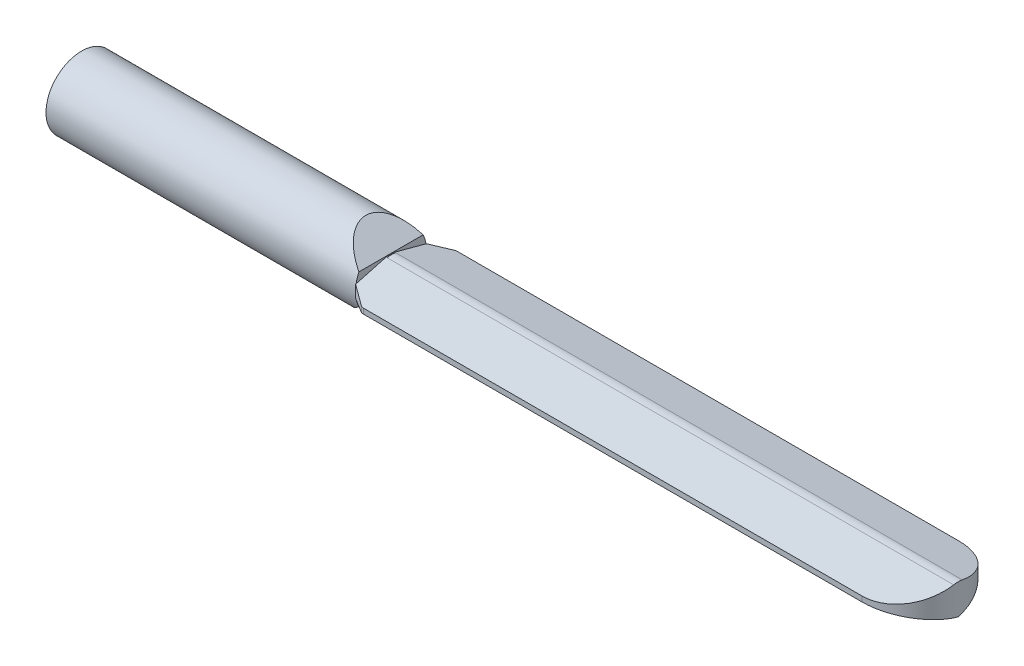
ISO-10303-21;
HEADER;
FILE_DESCRIPTION(('STEP AP214'),'2;1');
FILE_NAME('part.step','',(''),(''),'','','');
FILE_SCHEMA(('AUTOMOTIVE_DESIGN { 1 0 10303 214 1 1 1 1 }'));
ENDSEC;
DATA;
#1=APPLICATION_CONTEXT('core data for automotive mechanical design processes');
#2=APPLICATION_PROTOCOL_DEFINITION('international standard','automotive_design',2000,#1);
#3=PRODUCT_CONTEXT('',#1,'mechanical');
#4=PRODUCT('Part','Part','',(#3));
#5=PRODUCT_RELATED_PRODUCT_CATEGORY('part','',(#4));
#6=PRODUCT_DEFINITION_FORMATION('','',#4);
#7=PRODUCT_DEFINITION_CONTEXT('part definition',#1,'design');
#8=PRODUCT_DEFINITION('design','',#6,#7);
#9=PRODUCT_DEFINITION_SHAPE('','',#8);
#10=(LENGTH_UNIT() NAMED_UNIT(*) SI_UNIT(.MILLI.,.METRE.));
#11=(NAMED_UNIT(*) PLANE_ANGLE_UNIT() SI_UNIT($,.RADIAN.));
#12=(NAMED_UNIT(*) SI_UNIT($,.STERADIAN.) SOLID_ANGLE_UNIT());
#13=UNCERTAINTY_MEASURE_WITH_UNIT(LENGTH_MEASURE(1.E-05),#10,'distance_accuracy_value','');
#14=(GEOMETRIC_REPRESENTATION_CONTEXT(3) GLOBAL_UNCERTAINTY_ASSIGNED_CONTEXT((#13)) GLOBAL_UNIT_ASSIGNED_CONTEXT((#10,
#11,#12)) REPRESENTATION_CONTEXT('',''));
#15=CARTESIAN_POINT('',(0.,0.,0.));
#16=DIRECTION('',(0.,0.,1.));
#17=DIRECTION('',(1.,0.,0.));
#18=AXIS2_PLACEMENT_3D('',#15,#16,#17);
#19=CARTESIAN_POINT('',(-117.132239803963,2.8,8.56407466456359));
#20=DIRECTION('',(0.999999971842602,0.,0.000237307383945253));
#21=DIRECTION('',(0.000237307383945253,0.,-0.999999971842602));
#22=AXIS2_PLACEMENT_3D('',#19,#20,#21);
#23=CYLINDRICAL_SURFACE('',#22,6.42);
#24=CARTESIAN_POINT('',(-55.7280068959359,2.8,8.57864634284846));
#25=DIRECTION('',(0.627517438225577,-0.778602507524096,0.));
#26=DIRECTION('',(0.778602471360075,0.627517409079057,0.000304786302781807));
#27=AXIS2_PLACEMENT_3D('',#24,#25,#26);
#28=ELLIPSE('',#27,10.2307916715817,6.42);
#29=CARTESIAN_POINT('',(-59.1336186924822,0.0552351559265948,14.381515263114));
#30=VERTEX_POINT('',#29);
#31=CARTESIAN_POINT('',(-59.1308639326483,0.0574553643348558,2.77311222677423));
#32=VERTEX_POINT('',#31);
#33=EDGE_CURVE('E466',#30,#32,#28,.T.);
#34=ORIENTED_EDGE('',*,*,#33,.F.);
#35=CARTESIAN_POINT('',(-59.1322414370918,2.8,8.57783849283242));
#36=DIRECTION('',(-0.999999971842602,0.,-0.000237307383945253));
#37=DIRECTION('',(-0.000237307383945253,0.,0.999999971842602));
#38=AXIS2_PLACEMENT_3D('',#35,#36,#37);
#39=CIRCLE('',#38,6.42);
#40=CARTESIAN_POINT('',(-59.1337408927519,1.66359520688498,14.8964603281552));
#41=VERTEX_POINT('',#40);
#42=EDGE_CURVE('E447',#30,#41,#39,.T.);
#43=ORIENTED_EDGE('',*,*,#42,.T.);
#44=CARTESIAN_POINT('',(-59.1337602043918,2.29364272164236,14.9778384928324));
#45=VERTEX_POINT('',#44);
#46=EDGE_CURVE('E452',#41,#45,#39,.T.);
#47=ORIENTED_EDGE('',*,*,#46,.T.);
#48=CARTESIAN_POINT('',(-59.1337602043918,3.30635727835764,14.9778384928324));
#49=VERTEX_POINT('',#48);
#50=EDGE_CURVE('E443',#45,#49,#39,.T.);
#51=ORIENTED_EDGE('',*,*,#50,.T.);
#52=CARTESIAN_POINT('',(-59.1337408927519,3.93640479311502,14.8964603281552));
#53=VERTEX_POINT('',#52);
#54=EDGE_CURVE('E422',#49,#53,#39,.T.);
#55=ORIENTED_EDGE('',*,*,#54,.T.);
#56=CARTESIAN_POINT('',(-59.1336186924822,5.54476484407341,14.381515263114));
#57=VERTEX_POINT('',#56);
#58=EDGE_CURVE('E433',#53,#57,#39,.T.);
#59=ORIENTED_EDGE('',*,*,#58,.T.);
#60=CARTESIAN_POINT('',(-55.7280068959359,2.8,8.57864634284846));
#61=DIRECTION('',(0.627517438225577,0.778602507524095,0.));
#62=DIRECTION('',(0.778602471360075,-0.627517409079057,0.000304786302781807));
#63=AXIS2_PLACEMENT_3D('',#60,#61,#62);
#64=ELLIPSE('',#63,10.2307916715817,6.42);
#65=CARTESIAN_POINT('',(-59.1308639326483,5.54254463566515,2.77311222677423));
#66=VERTEX_POINT('',#65);
#67=EDGE_CURVE('E56',#66,#57,#64,.T.);
#68=ORIENTED_EDGE('',*,*,#67,.F.);
#69=CARTESIAN_POINT('',(-59.1307393914569,3.87395239703215,2.2483026494417));
#70=VERTEX_POINT('',#69);
#71=EDGE_CURVE('E437',#66,#70,#39,.T.);
#72=ORIENTED_EDGE('',*,*,#71,.T.);
#73=CARTESIAN_POINT('',(-59.1324678748693,3.87395228188942,2.24830221972318));
#74=CARTESIAN_POINT('',(-59.13214287009,3.87395230353957,2.24830230052267));
#75=CARTESIAN_POINT('',(-59.1318178653106,3.87395232518973,2.24830238132215));
#76=CARTESIAN_POINT('',(-59.1311678557519,3.87395236849005,2.24830254292113));
#77=CARTESIAN_POINT('',(-59.1308428509726,3.8739523901402,2.24830262372061));
#78=CARTESIAN_POINT('',(-59.1305178461932,3.87395241179036,2.2483027045201));
#79=B_SPLINE_CURVE_WITH_KNOTS('',3,(#73,#74,#75,#76,#77,#78),.UNSPECIFIED.,.F.,.F.,(4,2,4),(0.,
0.000975014370332675,0.00195002874066535),.UNSPECIFIED.);
#80=CARTESIAN_POINT('',(-59.1322414370918,3.87395229697354,2.24830227601791));
#81=VERTEX_POINT('',#80);
#82=EDGE_CURVE('E283',#81,#70,#79,.T.);
#83=ORIENTED_EDGE('',*,*,#82,.F.);
#84=CARTESIAN_POINT('',(-59.1322414370918,2.8,8.57783849283242));
#85=DIRECTION('',(-1.,0.,0.));
#86=DIRECTION('',(0.,0.,1.));
#87=AXIS2_PLACEMENT_3D('',#84,#85,#86);
#88=ELLIPSE('',#87,6.4200001807705,6.42);
#89=CARTESIAN_POINT('',(-59.1322414370918,3.24527621659354,2.17329858735413));
#90=VERTEX_POINT('',#89);
#91=EDGE_CURVE('E292',#90,#81,#88,.F.);
#92=ORIENTED_EDGE('',*,*,#91,.F.);
#93=CARTESIAN_POINT('',(-68.4825954280634,2.8,8.57561958472538));
#94=DIRECTION('',(0.564967003424933,0.,0.825113498278299));
#95=DIRECTION('',(0.825113498278299,0.,-0.564967003424933));
#96=AXIS2_PLACEMENT_3D('',#93,#94,#95);
#97=ELLIPSE('',#96,11.359558836909,6.42);
#98=CARTESIAN_POINT('',(-59.1307213454424,3.23003854493289,2.17225775887914));
#99=VERTEX_POINT('',#98);
#100=EDGE_CURVE('E514',#90,#99,#97,.F.);
#101=ORIENTED_EDGE('',*,*,#100,.T.);
#102=CARTESIAN_POINT('',(-59.1307213454424,2.36996145506712,2.17225775887914));
#103=VERTEX_POINT('',#102);
#104=EDGE_CURVE('E439',#99,#103,#39,.T.);
#105=ORIENTED_EDGE('',*,*,#104,.T.);
#106=CARTESIAN_POINT('',(-59.1322414370918,2.35472378340646,2.17329858735413));
#107=VERTEX_POINT('',#106);
#108=EDGE_CURVE('E293',#103,#107,#97,.F.);
#109=ORIENTED_EDGE('',*,*,#108,.T.);
#110=CARTESIAN_POINT('',(-59.1322414370918,1.72604770302646,2.24830227601791));
#111=VERTEX_POINT('',#110);
#112=EDGE_CURVE('E515',#111,#107,#88,.F.);
#113=ORIENTED_EDGE('',*,*,#112,.F.);
#114=CARTESIAN_POINT('',(-59.1305178461932,1.72604758820964,2.2483027045201));
#115=CARTESIAN_POINT('',(-59.1308428509726,1.7260476098598,2.24830262372061));
#116=CARTESIAN_POINT('',(-59.1311678557519,1.72604763150995,2.24830254292113));
#117=CARTESIAN_POINT('',(-59.1318178653106,1.72604767481027,2.24830238132215));
#118=CARTESIAN_POINT('',(-59.13214287009,1.72604769646043,2.24830230052267));
#119=CARTESIAN_POINT('',(-59.1324678748693,1.72604771811058,2.24830221972318));
#120=B_SPLINE_CURVE_WITH_KNOTS('',3,(#114,#115,#116,#117,#118,#119),.UNSPECIFIED.,.F.,.F.,(4,2,
4),(0.,0.000975014370332675,0.00195002874066535),.UNSPECIFIED.);
#121=CARTESIAN_POINT('',(-59.1307393914569,1.72604760296785,2.2483026494417));
#122=VERTEX_POINT('',#121);
#123=EDGE_CURVE('E303',#122,#111,#120,.T.);
#124=ORIENTED_EDGE('',*,*,#123,.F.);
#125=EDGE_CURVE('E450',#122,#32,#39,.T.);
#126=ORIENTED_EDGE('',*,*,#125,.T.);
#127=EDGE_LOOP('',(#34,#43,#47,#51,#55,#59,#68,#72,#83,#92,#101,#105,#109,#113,#124,#126));
#128=FACE_BOUND('',#127,.T.);
#129=CARTESIAN_POINT('',(-115.130716290558,2.8,8.56454964088584));
#130=DIRECTION('',(-1.,0.,0.));
#131=DIRECTION('',(0.,0.,1.));
#132=AXIS2_PLACEMENT_3D('',#129,#130,#131);
#133=ELLIPSE('',#132,6.4200001807705,6.42);
#134=CARTESIAN_POINT('',(-115.130716290558,2.8,14.9845498216563));
#135=VERTEX_POINT('',#134);
#136=EDGE_CURVE('E11',#135,#135,#133,.T.);
#137=ORIENTED_EDGE('',*,*,#136,.F.);
#138=EDGE_LOOP('',(#137));
#139=FACE_BOUND('',#138,.T.);
#140=ADVANCED_FACE('F40',(#128,#139),#23,.T.);
#141=CARTESIAN_POINT('',(34.8662397956082,0.,8.69000000000002));
#142=DIRECTION('',(0.,0.965925826289066,0.258819045102528));
#143=DIRECTION('',(1.,0.,0.));
#144=AXIS2_PLACEMENT_3D('',#141,#142,#143);
#145=PLANE('',#144);
#146=DIRECTION('',(1.,0.,0.));
#147=VECTOR('',#146,1.);
#148=CARTESIAN_POINT('',(34.8662397956082,0.000289587050011607,8.68891924641616));
#149=LINE('',#148,#147);
#150=CARTESIAN_POINT('',(-58.9436505515468,0.000289587050009449,8.68891924641616));
#151=VERTEX_POINT('',#150);
#152=CARTESIAN_POINT('',(43.5551590420244,0.000289587050012603,8.68891924641616));
#153=VERTEX_POINT('',#152);
#154=EDGE_CURVE('E343',#151,#153,#149,.T.);
#155=ORIENTED_EDGE('',*,*,#154,.F.);
#156=DIRECTION('',(0.,-0.258819045102528,0.965925826289066));
#157=VECTOR('',#156,1.);
#158=CARTESIAN_POINT('',(-58.9436505515468,0.,8.69000000000002));
#159=LINE('',#158,#157);
#160=CARTESIAN_POINT('',(-58.9436505515468,0.208340649413047,7.91246211110868));
#161=VERTEX_POINT('',#160);
#162=EDGE_CURVE('E458',#151,#161,#159,.F.);
#163=ORIENTED_EDGE('',*,*,#162,.T.);
#164=DIRECTION('',(0.305754930362129,0.246424264976754,-0.919667877111034));
#165=VECTOR('',#164,1.);
#166=CARTESIAN_POINT('',(-50.4080675965343,7.08762384967373,-17.7613723119185));
#167=LINE('',#166,#165);
#168=CARTESIAN_POINT('',(-59.1322181355043,0.0563639397648368,8.47964691308289));
#169=VERTEX_POINT('',#168);
#170=EDGE_CURVE('E461',#161,#169,#167,.F.);
#171=ORIENTED_EDGE('',*,*,#170,.T.);
#172=DIRECTION('',(0.00022922133135417,0.258819038303038,-0.965925800913027));
#173=VECTOR('',#172,1.);
#174=CARTESIAN_POINT('',(-59.1333280189343,-1.19683077944475,13.15663327695));
#175=LINE('',#174,#173);
#176=EDGE_CURVE('E324',#122,#169,#175,.F.);
#177=ORIENTED_EDGE('',*,*,#176,.F.);
#178=ORIENTED_EDGE('',*,*,#123,.T.);
#179=DIRECTION('',(0.,0.258819045102528,-0.965925826289066));
#180=VECTOR('',#179,1.);
#181=CARTESIAN_POINT('',(-59.1322414370918,0.403169246195493,7.18535188914924));
#182=LINE('',#181,#180);
#183=CARTESIAN_POINT('',(-59.1322414370918,1.74614488083327,2.17329858735413));
#184=VERTEX_POINT('',#183);
#185=EDGE_CURVE('E328',#184,#111,#182,.F.);
#186=ORIENTED_EDGE('',*,*,#185,.F.);
#187=DIRECTION('',(0.815818536320453,0.149677118278064,-0.558602610144214));
#188=VECTOR('',#187,1.);
#189=CARTESIAN_POINT('',(0.246375695347363,12.6402590790781,-38.4840891039518));
#190=LINE('',#189,#188);
#191=CARTESIAN_POINT('',(-55.958218902423,2.32847848222653,0.));
#192=VERTEX_POINT('',#191);
#193=EDGE_CURVE('E332',#192,#184,#190,.F.);
#194=ORIENTED_EDGE('',*,*,#193,.F.);
#195=DIRECTION('',(-1.,0.,0.));
#196=VECTOR('',#195,1.);
#197=CARTESIAN_POINT('',(-55.958218902423,2.32847848222653,0.));
#198=LINE('',#197,#196);
#199=CARTESIAN_POINT('',(34.8662397956082,2.32847848222653,0.));
#200=VERTEX_POINT('',#199);
#201=EDGE_CURVE('E336',#200,#192,#198,.T.);
#202=ORIENTED_EDGE('',*,*,#201,.F.);
#203=CARTESIAN_POINT('',(34.8662397956082,0.000289587049998562,8.68891924641621));
#204=DIRECTION('',(0.,0.965925826289066,0.258819045102528));
#205=DIRECTION('',(0.,-0.258819045102528,0.965925826289066));
#206=AXIS2_PLACEMENT_3D('',#203,#204,#205);
#207=ELLIPSE('',#206,8.99543112932145,8.68891924641621);
#208=EDGE_CURVE('E340',#153,#200,#207,.T.);
#209=ORIENTED_EDGE('',*,*,#208,.F.);
#210=EDGE_LOOP('',(#155,#163,#171,#177,#178,#186,#194,#202,#209));
#211=FACE_BOUND('',#210,.T.);
#212=ADVANCED_FACE('F276',(#211),#145,.F.);
#213=CARTESIAN_POINT('',(34.8662397956082,0.,8.6878384928323));
#214=DIRECTION('',(0.,0.965925826289069,-0.258819045102518));
#215=DIRECTION('',(-1.,0.,0.));
#216=AXIS2_PLACEMENT_3D('',#213,#214,#215);
#217=PLANE('',#216);
#218=DIRECTION('',(-0.305754930362118,-0.246424264976745,-0.91966787711104));
#219=VECTOR('',#218,1.);
#220=CARTESIAN_POINT('',(-50.4080675965349,7.08762384967324,35.1392108047501));
#221=LINE('',#220,#219);
#222=CARTESIAN_POINT('',(-59.1323173884015,0.0562839465420773,8.89789304097782));
#223=VERTEX_POINT('',#222);
#224=CARTESIAN_POINT('',(-58.9436505515468,0.208340649413051,9.46537638172371));
#225=VERTEX_POINT('',#224);
#226=EDGE_CURVE('E64',#223,#225,#221,.F.);
#227=ORIENTED_EDGE('',*,*,#226,.T.);
#228=DIRECTION('',(0.,0.258819045102518,0.965925826289069));
#229=VECTOR('',#228,1.);
#230=CARTESIAN_POINT('',(-58.9436505515468,0.,8.6878384928323));
#231=LINE('',#230,#229);
#232=EDGE_CURVE('E50',#225,#151,#231,.F.);
#233=ORIENTED_EDGE('',*,*,#232,.T.);
#234=ORIENTED_EDGE('',*,*,#154,.T.);
#235=CARTESIAN_POINT('',(34.8662397956082,0.000289587050024583,8.68891924641621));
#236=DIRECTION('',(0.,0.965925826289069,-0.258819045102518));
#237=DIRECTION('',(0.,-0.258819045102518,-0.965925826289069));
#238=AXIS2_PLACEMENT_3D('',#235,#236,#237);
#239=ELLIPSE('',#238,8.99543112932142,8.68891924641621);
#240=CARTESIAN_POINT('',(34.8662397956082,2.32847848222646,17.3778384928324));
#241=VERTEX_POINT('',#240);
#242=EDGE_CURVE('E361',#241,#153,#239,.T.);
#243=ORIENTED_EDGE('',*,*,#242,.F.);
#244=DIRECTION('',(1.,0.,0.));
#245=VECTOR('',#244,1.);
#246=CARTESIAN_POINT('',(34.8662397956082,2.32847848222646,17.3778384928324));
#247=LINE('',#246,#245);
#248=CARTESIAN_POINT('',(-55.3238356065649,2.32847848222646,17.3778384928324));
#249=VERTEX_POINT('',#248);
#250=EDGE_CURVE('E365',#249,#241,#247,.T.);
#251=ORIENTED_EDGE('',*,*,#250,.F.);
#252=CARTESIAN_POINT('',(-55.3238356065649,2.06052928979534,16.3778384928324));
#253=DIRECTION('',(0.,0.965925826289069,-0.258819045102518));
#254=DIRECTION('',(0.,-0.258819045102518,-0.965925826289069));
#255=AXIS2_PLACEMENT_3D('',#252,#253,#254);
#256=ELLIPSE('',#255,1.03527618041008,1.);
#257=CARTESIAN_POINT('',(-55.8893639621164,2.28151471962211,17.2025673446784));
#258=VERTEX_POINT('',#257);
#259=EDGE_CURVE('E317',#249,#258,#256,.F.);
#260=ORIENTED_EDGE('',*,*,#259,.T.);
#261=DIRECTION('',(-0.815420062977005,-0.149822501051534,-0.559145186041372));
#262=VECTOR('',#261,1.);
#263=CARTESIAN_POINT('',(-55.2340840696887,2.40191361195973,17.6519021280574));
#264=LINE('',#263,#262);
#265=CARTESIAN_POINT('',(-59.1337602043918,1.68540042039177,14.9778384928324));
#266=VERTEX_POINT('',#265);
#267=EDGE_CURVE('E368',#266,#258,#264,.F.);
#268=ORIENTED_EDGE('',*,*,#267,.F.);
#269=DIRECTION('',(0.00022922133135417,-0.258819038303028,-0.965925800913029));
#270=VECTOR('',#269,1.);
#271=CARTESIAN_POINT('',(-59.1339924452325,1.94762885562546,15.9564883363138));
#272=LINE('',#271,#270);
#273=EDGE_CURVE('E376',#41,#266,#272,.F.);
#274=ORIENTED_EDGE('',*,*,#273,.F.);
#275=EDGE_CURVE('E372',#223,#41,#272,.F.);
#276=ORIENTED_EDGE('',*,*,#275,.F.);
#277=EDGE_LOOP('',(#227,#233,#234,#243,#251,#260,#268,#274,#276));
#278=FACE_BOUND('',#277,.T.);
#279=ADVANCED_FACE('F272',(#278),#217,.F.);
#280=CARTESIAN_POINT('',(-59.1322414370918,2.8,8.57783849283242));
#281=DIRECTION('',(-0.999999971842602,0.,-0.000237307383945253));
#282=DIRECTION('',(-0.000237307383945253,0.,0.999999971842602));
#283=AXIS2_PLACEMENT_3D('',#280,#281,#282);
#284=PLANE('',#283);
#285=DIRECTION('',(0.000237307379604913,-0.000191258719927884,-0.999999953552654));
#286=VECTOR('',#285,1.);
#287=CARTESIAN_POINT('',(-59.1322413125653,5.54365473986928,8.57731374494412));
#288=LINE('',#287,#286);
#289=EDGE_CURVE('E435',#57,#66,#288,.T.);
#290=ORIENTED_EDGE('',*,*,#289,.F.);
#291=ORIENTED_EDGE('',*,*,#58,.F.);
#292=DIRECTION('',(-0.00022922133135417,-0.258819038303028,0.965925800913029));
#293=VECTOR('',#292,1.);
#294=CARTESIAN_POINT('',(-59.1343248031121,3.27709827494915,17.3570257517116));
#295=LINE('',#294,#293);
#296=CARTESIAN_POINT('',(-59.1324520563923,5.39165935058695,9.46537638172373));
#297=VERTEX_POINT('',#296);
#298=EDGE_CURVE('E426',#297,#53,#295,.T.);
#299=ORIENTED_EDGE('',*,*,#298,.F.);
#300=CARTESIAN_POINT('',(-59.1322677973756,2.49388187171974,8.68891924641618));
#301=DIRECTION('',(-0.999999971842602,0.,-0.000237307383945253));
#302=DIRECTION('',(-0.000237307383945253,0.,0.999999971842602));
#303=AXIS2_PLACEMENT_3D('',#300,#301,#302);
#304=ELLIPSE('',#303,3.0000000844722,3.);
#305=CARTESIAN_POINT('',(-59.1320835383589,5.39165935058694,7.9124621111086));
#306=VERTEX_POINT('',#305);
#307=EDGE_CURVE('E197',#297,#306,#304,.T.);
#308=ORIENTED_EDGE('',*,*,#307,.T.);
#309=DIRECTION('',(0.00022922133135417,-0.258819038303038,-0.965925800913027));
#310=VECTOR('',#309,1.);
#311=CARTESIAN_POINT('',(-59.1336602492637,7.17195962913816,14.5566332033906));
#312=LINE('',#311,#310);
#313=EDGE_CURVE('E228',#306,#70,#312,.T.);
#314=ORIENTED_EDGE('',*,*,#313,.T.);
#315=ORIENTED_EDGE('',*,*,#71,.F.);
#316=EDGE_LOOP('',(#290,#291,#299,#308,#314,#315));
#317=FACE_BOUND('',#316,.T.);
#318=ADVANCED_FACE('F275',(#317),#284,.F.);
#319=DIRECTION('',(-0.000237307379604913,-0.000191258719927884,0.999999953552654));
#320=VECTOR('',#319,1.);
#321=CARTESIAN_POINT('',(-59.1322413125653,0.0563452601307249,8.57731374494412));
#322=LINE('',#321,#320);
#323=EDGE_CURVE('E534',#32,#169,#322,.T.);
#324=ORIENTED_EDGE('',*,*,#323,.F.);
#325=ORIENTED_EDGE('',*,*,#125,.F.);
#326=ORIENTED_EDGE('',*,*,#176,.T.);
#327=EDGE_LOOP('',(#324,#325,#326));
#328=FACE_BOUND('',#327,.T.);
#329=ADVANCED_FACE('F533',(#328),#284,.F.);
#330=EDGE_CURVE('E213',#223,#30,#322,.T.);
#331=ORIENTED_EDGE('',*,*,#330,.F.);
#332=ORIENTED_EDGE('',*,*,#275,.T.);
#333=ORIENTED_EDGE('',*,*,#42,.F.);
#334=EDGE_LOOP('',(#331,#332,#333));
#335=FACE_BOUND('',#334,.T.);
#336=ADVANCED_FACE('F488',(#335),#284,.F.);
#337=CARTESIAN_POINT('',(34.8662397956082,2.49388187171974,8.68891924641617));
#338=DIRECTION('',(-1.,0.,0.));
#339=DIRECTION('',(0.,0.,1.));
#340=AXIS2_PLACEMENT_3D('',#337,#338,#339);
#341=CYLINDRICAL_SURFACE('',#340,3.);
#342=DIRECTION('',(-1.,0.,0.));
#343=VECTOR('',#342,1.);
#344=CARTESIAN_POINT('',(34.8662397956082,5.39165935058695,9.46537638172373));
#345=LINE('',#344,#343);
#346=CARTESIAN_POINT('',(-58.9436505515468,5.39165935058695,9.46537638172373));
#347=VERTEX_POINT('',#346);
#348=EDGE_CURVE('E210',#347,#297,#345,.T.);
#349=ORIENTED_EDGE('',*,*,#348,.F.);
#350=CARTESIAN_POINT('',(-55.3481858300042,2.49388187171974,8.68891924641618));
#351=DIRECTION('',(0.627517438225577,0.778602507524095,0.));
#352=DIRECTION('',(-0.778602507524095,0.627517438225577,0.));
#353=AXIS2_PLACEMENT_3D('',#350,#351,#352);
#354=ELLIPSE('',#353,4.78074363715383,3.);
#355=CARTESIAN_POINT('',(-58.9436505515468,5.39165935058695,7.91246211110863));
#356=VERTEX_POINT('',#355);
#357=EDGE_CURVE('E196',#347,#356,#354,.F.);
#358=ORIENTED_EDGE('',*,*,#357,.T.);
#359=DIRECTION('',(-1.,0.,0.));
#360=VECTOR('',#359,1.);
#361=CARTESIAN_POINT('',(-55.958218902423,5.39165935058694,7.9124621111086));
#362=LINE('',#361,#360);
#363=EDGE_CURVE('E209',#306,#356,#362,.F.);
#364=ORIENTED_EDGE('',*,*,#363,.F.);
#365=ORIENTED_EDGE('',*,*,#307,.F.);
#366=EDGE_LOOP('',(#349,#358,#364,#365));
#367=FACE_BOUND('',#366,.T.);
#368=ADVANCED_FACE('F42',(#367),#341,.T.);
#369=CARTESIAN_POINT('',(43.5203967151337,5.39165935058694,7.91246211110859));
#370=VERTEX_POINT('',#369);
#371=EDGE_CURVE('E216',#356,#370,#362,.F.);
#372=ORIENTED_EDGE('',*,*,#371,.F.);
#373=CARTESIAN_POINT('',(-58.9436505515468,2.49388187171974,8.68891924641618));
#374=DIRECTION('',(-1.,0.,0.));
#375=DIRECTION('',(0.,0.,1.));
#376=AXIS2_PLACEMENT_3D('',#373,#374,#375);
#377=CIRCLE('',#376,3.);
#378=EDGE_CURVE('E186',#356,#347,#377,.F.);
#379=ORIENTED_EDGE('',*,*,#378,.T.);
#380=CARTESIAN_POINT('',(43.5203967151337,5.39165935058695,9.46537638172373));
#381=VERTEX_POINT('',#380);
#382=EDGE_CURVE('E222',#381,#347,#345,.T.);
#383=ORIENTED_EDGE('',*,*,#382,.F.);
#384=CARTESIAN_POINT('',(43.5203967151337,5.39165935058694,7.91246211110859));
#385=CARTESIAN_POINT('',(43.5274161954196,5.41260344746621,7.99058563525631));
#386=CARTESIAN_POINT('',(43.5334336082892,5.4303914599033,8.06964927788868));
#387=CARTESIAN_POINT('',(43.5433491024557,5.45953968504035,8.22910629146036));
#388=CARTESIAN_POINT('',(43.5472465807495,5.47089806890734,8.30950003404535));
#389=CARTESIAN_POINT('',(43.5527396517106,5.48687543773905,8.46918347624755));
#390=CARTESIAN_POINT('',(43.5543856182854,5.49164193330061,8.54845665615965));
#391=CARTESIAN_POINT('',(43.5555023257781,5.49487587917558,8.70711320610669));
#392=CARTESIAN_POINT('',(43.5549738674154,5.49334564822244,8.78649652482056));
#393=CARTESIAN_POINT('',(43.5513109575309,5.48272745658037,8.96631680907991));
#394=CARTESIAN_POINT('',(43.5475093013821,5.47170433909288,9.06663130175489));
#395=CARTESIAN_POINT('',(43.5365074108368,5.4394509606525,9.26694570528913));
#396=CARTESIAN_POINT('',(43.5292577383407,5.41807213310539,9.36691901556857));
#397=CARTESIAN_POINT('',(43.5203967151337,5.39165935058695,9.46537638172373));
#398=B_SPLINE_CURVE_WITH_KNOTS('',3,(#384,#385,#386,#387,#388,#389,#390,#391,#392,#393,#394,
#395,#396,#397),.UNSPECIFIED.,.F.,.F.,(4,2,2,2,2,2,4),(0.,0.243492877537123,0.487054979031359,
0.725073383174689,0.963004146249747,1.26539270741895,1.5722540294871),.UNSPECIFIED.);
#399=EDGE_CURVE('E218',#370,#381,#398,.T.);
#400=ORIENTED_EDGE('',*,*,#399,.F.);
#401=EDGE_LOOP('',(#372,#379,#383,#400));
#402=FACE_BOUND('',#401,.T.);
#403=ADVANCED_FACE('F217',(#402),#341,.T.);
#404=CARTESIAN_POINT('',(-59.1337602043918,5.6,14.9778384928324));
#405=DIRECTION('',(-0.999999971842602,0.,-0.000237307383945253));
#406=DIRECTION('',(-0.000237307383945253,0.,0.999999971842602));
#407=AXIS2_PLACEMENT_3D('',#404,#405,#406);
#408=PLANE('',#407);
#409=DIRECTION('',(0.,-1.,0.));
#410=VECTOR('',#409,1.);
#411=CARTESIAN_POINT('',(-59.1337602043918,5.6,14.9778384928324));
#412=LINE('',#411,#410);
#413=EDGE_CURVE('E406',#45,#266,#412,.T.);
#414=ORIENTED_EDGE('',*,*,#413,.F.);
#415=ORIENTED_EDGE('',*,*,#46,.F.);
#416=ORIENTED_EDGE('',*,*,#273,.T.);
#417=EDGE_LOOP('',(#414,#415,#416));
#418=FACE_BOUND('',#417,.T.);
#419=ADVANCED_FACE('F257',(#418),#408,.T.);
#420=CARTESIAN_POINT('',(-55.958218902423,5.6,0.));
#421=DIRECTION('',(0.564967003424933,0.,0.825113498278299));
#422=DIRECTION('',(0.825113498278299,0.,-0.564967003424933));
#423=AXIS2_PLACEMENT_3D('',#420,#421,#422);
#424=PLANE('',#423);
#425=ORIENTED_EDGE('',*,*,#108,.F.);
#426=DIRECTION('',(0.,-1.,0.));
#427=VECTOR('',#426,1.);
#428=CARTESIAN_POINT('',(-59.1307213454424,5.6,2.17225775887914));
#429=LINE('',#428,#427);
#430=EDGE_CURVE('E430',#99,#103,#429,.T.);
#431=ORIENTED_EDGE('',*,*,#430,.F.);
#432=ORIENTED_EDGE('',*,*,#100,.F.);
#433=DIRECTION('',(0.,-1.,0.));
#434=VECTOR('',#433,1.);
#435=CARTESIAN_POINT('',(-59.1322414370918,5.6,2.17329858735413));
#436=LINE('',#435,#434);
#437=CARTESIAN_POINT('',(-59.1322414370918,3.85385511916673,2.17329858735413));
#438=VERTEX_POINT('',#437);
#439=EDGE_CURVE('E391',#438,#90,#436,.T.);
#440=ORIENTED_EDGE('',*,*,#439,.F.);
#441=DIRECTION('',(0.815818536320453,-0.149677118278064,-0.558602610144214));
#442=VECTOR('',#441,1.);
#443=CARTESIAN_POINT('',(-55.958218902423,3.27152151777347,0.));
#444=LINE('',#443,#442);
#445=CARTESIAN_POINT('',(-55.958218902423,3.27152151777347,0.));
#446=VERTEX_POINT('',#445);
#447=EDGE_CURVE('E346',#438,#446,#444,.T.);
#448=ORIENTED_EDGE('',*,*,#447,.T.);
#449=DIRECTION('',(0.,-1.,0.));
#450=VECTOR('',#449,1.);
#451=CARTESIAN_POINT('',(-55.958218902423,5.6,0.));
#452=LINE('',#451,#450);
#453=EDGE_CURVE('E395',#446,#192,#452,.T.);
#454=ORIENTED_EDGE('',*,*,#453,.T.);
#455=ORIENTED_EDGE('',*,*,#193,.T.);
#456=EDGE_CURVE('E396',#107,#184,#436,.T.);
#457=ORIENTED_EDGE('',*,*,#456,.F.);
#458=EDGE_LOOP('',(#425,#431,#432,#440,#448,#454,#455,#457));
#459=FACE_BOUND('',#458,.T.);
#460=ADVANCED_FACE('F253',(#459),#424,.F.);
#461=CARTESIAN_POINT('',(-59.1322414370918,5.6,8.57783849283242));
#462=DIRECTION('',(-1.,0.,0.));
#463=DIRECTION('',(0.,0.,1.));
#464=AXIS2_PLACEMENT_3D('',#461,#462,#463);
#465=PLANE('',#464);
#466=ORIENTED_EDGE('',*,*,#185,.T.);
#467=ORIENTED_EDGE('',*,*,#112,.T.);
#468=ORIENTED_EDGE('',*,*,#456,.T.);
#469=EDGE_LOOP('',(#466,#467,#468));
#470=FACE_BOUND('',#469,.T.);
#471=ADVANCED_FACE('F256',(#470),#465,.T.);
#472=ORIENTED_EDGE('',*,*,#439,.T.);
#473=ORIENTED_EDGE('',*,*,#91,.T.);
#474=DIRECTION('',(0.,-0.258819045102528,-0.965925826289066));
#475=VECTOR('',#474,1.);
#476=CARTESIAN_POINT('',(-59.1322414370918,5.5719596232081,8.58535188914927));
#477=LINE('',#476,#475);
#478=EDGE_CURVE('E349',#81,#438,#477,.T.);
#479=ORIENTED_EDGE('',*,*,#478,.T.);
#480=EDGE_LOOP('',(#472,#473,#479));
#481=FACE_BOUND('',#480,.T.);
#482=ADVANCED_FACE('F261',(#481),#465,.T.);
#483=CARTESIAN_POINT('',(-55.958218902423,3.27152151777347,0.));
#484=DIRECTION('',(0.,0.965925826289066,-0.258819045102528));
#485=DIRECTION('',(-1.,0.,0.));
#486=AXIS2_PLACEMENT_3D('',#483,#484,#485);
#487=PLANE('',#486);
#488=ORIENTED_EDGE('',*,*,#313,.F.);
#489=ORIENTED_EDGE('',*,*,#363,.T.);
#490=ORIENTED_EDGE('',*,*,#371,.T.);
#491=CARTESIAN_POINT('',(34.8662397956082,5.59971041295,8.68891924641621));
#492=DIRECTION('',(0.,0.965925826289066,-0.258819045102528));
#493=DIRECTION('',(0.,-0.258819045102528,-0.965925826289066));
#494=AXIS2_PLACEMENT_3D('',#491,#492,#493);
#495=ELLIPSE('',#494,8.99543112932145,8.68891924641621);
#496=CARTESIAN_POINT('',(34.8662397956082,3.27152151777347,0.));
#497=VERTEX_POINT('',#496);
#498=EDGE_CURVE('E354',#497,#370,#495,.F.);
#499=ORIENTED_EDGE('',*,*,#498,.F.);
#500=DIRECTION('',(1.,0.,0.));
#501=VECTOR('',#500,1.);
#502=CARTESIAN_POINT('',(34.8662397956082,3.27152151777347,0.));
#503=LINE('',#502,#501);
#504=EDGE_CURVE('E357',#446,#497,#503,.T.);
#505=ORIENTED_EDGE('',*,*,#504,.F.);
#506=ORIENTED_EDGE('',*,*,#447,.F.);
#507=ORIENTED_EDGE('',*,*,#478,.F.);
#508=ORIENTED_EDGE('',*,*,#82,.T.);
#509=EDGE_LOOP('',(#488,#489,#490,#499,#505,#506,#507,#508));
#510=FACE_BOUND('',#509,.T.);
#511=ADVANCED_FACE('F225',(#510),#487,.T.);
#512=DIRECTION('',(0.00022922133135417,0.258819038303028,-0.965925800913029));
#513=VECTOR('',#512,1.);
#514=CARTESIAN_POINT('',(-59.1336602149031,4.02749999406793,14.5564884098732));
#515=LINE('',#514,#513);
#516=CARTESIAN_POINT('',(-59.1337602043918,3.91459957960823,14.9778384928324));
#517=VERTEX_POINT('',#516);
#518=EDGE_CURVE('E380',#517,#53,#515,.T.);
#519=ORIENTED_EDGE('',*,*,#518,.T.);
#520=ORIENTED_EDGE('',*,*,#54,.F.);
#521=EDGE_CURVE('E295',#517,#49,#412,.T.);
#522=ORIENTED_EDGE('',*,*,#521,.F.);
#523=EDGE_LOOP('',(#519,#520,#522));
#524=FACE_BOUND('',#523,.T.);
#525=ADVANCED_FACE('F263',(#524),#408,.T.);
#526=CARTESIAN_POINT('',(-55.6337602043918,5.6,17.3778384928324));
#527=DIRECTION('',(-0.565528355551526,0.,0.824728851845979));
#528=DIRECTION('',(0.824728851845979,0.,0.565528355551526));
#529=AXIS2_PLACEMENT_3D('',#526,#527,#528);
#530=PLANE('',#529);
#531=ORIENTED_EDGE('',*,*,#267,.T.);
#532=DIRECTION('',(0.,-1.,0.));
#533=VECTOR('',#532,1.);
#534=CARTESIAN_POINT('',(-55.8893639621164,5.6,17.2025673446784));
#535=LINE('',#534,#533);
#536=CARTESIAN_POINT('',(-55.8893639621164,3.31848528037789,17.2025673446784));
#537=VERTEX_POINT('',#536);
#538=EDGE_CURVE('E314',#258,#537,#535,.F.);
#539=ORIENTED_EDGE('',*,*,#538,.T.);
#540=DIRECTION('',(-0.815420062977005,0.149822501051534,-0.559145186041372));
#541=VECTOR('',#540,1.);
#542=CARTESIAN_POINT('',(-55.9182263998485,3.32378836623976,17.182775958805));
#543=LINE('',#542,#541);
#544=EDGE_CURVE('E384',#537,#517,#543,.T.);
#545=ORIENTED_EDGE('',*,*,#544,.T.);
#546=ORIENTED_EDGE('',*,*,#521,.T.);
#547=DIRECTION('',(0.,-1.,0.));
#548=VECTOR('',#547,1.);
#549=CARTESIAN_POINT('',(-59.1337602043918,5.6,14.9778384928324));
#550=LINE('',#549,#548);
#551=EDGE_CURVE('E417',#49,#45,#550,.T.);
#552=ORIENTED_EDGE('',*,*,#551,.T.);
#553=ORIENTED_EDGE('',*,*,#413,.T.);
#554=EDGE_LOOP('',(#531,#539,#545,#546,#552,#553));
#555=FACE_BOUND('',#554,.T.);
#556=ADVANCED_FACE('F266',(#555),#530,.T.);
#557=CARTESIAN_POINT('',(34.8662397956082,5.6,17.3778384928324));
#558=DIRECTION('',(0.,0.,1.));
#559=DIRECTION('',(1.,0.,0.));
#560=AXIS2_PLACEMENT_3D('',#557,#558,#559);
#561=PLANE('',#560);
#562=DIRECTION('',(-1.,0.,0.));
#563=VECTOR('',#562,1.);
#564=CARTESIAN_POINT('',(-55.6337602043918,3.27152151777354,17.3778384928324));
#565=LINE('',#564,#563);
#566=CARTESIAN_POINT('',(34.8662397956082,3.27152151777354,17.3778384928324));
#567=VERTEX_POINT('',#566);
#568=CARTESIAN_POINT('',(-55.3238356065649,3.27152151777354,17.3778384928324));
#569=VERTEX_POINT('',#568);
#570=EDGE_CURVE('E387',#567,#569,#565,.T.);
#571=ORIENTED_EDGE('',*,*,#570,.T.);
#572=DIRECTION('',(0.,-1.,0.));
#573=VECTOR('',#572,1.);
#574=CARTESIAN_POINT('',(-55.3238356065649,5.6,17.3778384928324));
#575=LINE('',#574,#573);
#576=EDGE_CURVE('E320',#569,#249,#575,.T.);
#577=ORIENTED_EDGE('',*,*,#576,.T.);
#578=ORIENTED_EDGE('',*,*,#250,.T.);
#579=DIRECTION('',(0.,-1.,0.));
#580=VECTOR('',#579,1.);
#581=CARTESIAN_POINT('',(34.8662397956082,5.6,17.3778384928324));
#582=LINE('',#581,#580);
#583=EDGE_CURVE('E403',#567,#241,#582,.T.);
#584=ORIENTED_EDGE('',*,*,#583,.F.);
#585=EDGE_LOOP('',(#571,#577,#578,#584));
#586=FACE_BOUND('',#585,.T.);
#587=ADVANCED_FACE('F246',(#586),#561,.T.);
#588=CARTESIAN_POINT('',(34.8662397956082,5.6,8.68891924641621));
#589=DIRECTION('',(0.,-1.,0.));
#590=DIRECTION('',(0.,0.,-1.));
#591=AXIS2_PLACEMENT_3D('',#588,#589,#590);
#592=CYLINDRICAL_SURFACE('',#591,8.68891924641621);
#593=ORIENTED_EDGE('',*,*,#498,.T.);
#594=ORIENTED_EDGE('',*,*,#399,.T.);
#595=CARTESIAN_POINT('',(34.8662397956082,5.59971041294998,8.68891924641621));
#596=DIRECTION('',(0.,0.965925826289069,0.258819045102518));
#597=DIRECTION('',(0.,-0.258819045102518,0.965925826289069));
#598=AXIS2_PLACEMENT_3D('',#595,#596,#597);
#599=ELLIPSE('',#598,8.99543112932142,8.68891924641621);
#600=EDGE_CURVE('E377',#381,#567,#599,.F.);
#601=ORIENTED_EDGE('',*,*,#600,.T.);
#602=ORIENTED_EDGE('',*,*,#583,.T.);
#603=ORIENTED_EDGE('',*,*,#242,.T.);
#604=ORIENTED_EDGE('',*,*,#208,.T.);
#605=DIRECTION('',(0.,-1.,0.));
#606=VECTOR('',#605,1.);
#607=CARTESIAN_POINT('',(34.8662397956082,5.6,0.));
#608=LINE('',#607,#606);
#609=EDGE_CURVE('E400',#497,#200,#608,.T.);
#610=ORIENTED_EDGE('',*,*,#609,.F.);
#611=EDGE_LOOP('',(#593,#594,#601,#602,#603,#604,#610));
#612=FACE_BOUND('',#611,.T.);
#613=ADVANCED_FACE('F240',(#612),#592,.T.);
#614=CARTESIAN_POINT('',(-55.958218902423,5.6,0.));
#615=DIRECTION('',(0.,0.,-1.));
#616=DIRECTION('',(-1.,0.,0.));
#617=AXIS2_PLACEMENT_3D('',#614,#615,#616);
#618=PLANE('',#617);
#619=ORIENTED_EDGE('',*,*,#609,.T.);
#620=ORIENTED_EDGE('',*,*,#201,.T.);
#621=ORIENTED_EDGE('',*,*,#453,.F.);
#622=ORIENTED_EDGE('',*,*,#504,.T.);
#623=EDGE_LOOP('',(#619,#620,#621,#622));
#624=FACE_BOUND('',#623,.T.);
#625=ADVANCED_FACE('F245',(#624),#618,.T.);
#626=CARTESIAN_POINT('',(34.8662397956082,3.27152151777354,17.3778384928324));
#627=DIRECTION('',(0.,0.965925826289069,0.258819045102518));
#628=DIRECTION('',(1.,0.,0.));
#629=AXIS2_PLACEMENT_3D('',#626,#627,#628);
#630=PLANE('',#629);
#631=ORIENTED_EDGE('',*,*,#600,.F.);
#632=ORIENTED_EDGE('',*,*,#382,.T.);
#633=ORIENTED_EDGE('',*,*,#348,.T.);
#634=ORIENTED_EDGE('',*,*,#298,.T.);
#635=ORIENTED_EDGE('',*,*,#518,.F.);
#636=ORIENTED_EDGE('',*,*,#544,.F.);
#637=CARTESIAN_POINT('',(-55.3238356065649,3.53947071020466,16.3778384928324));
#638=DIRECTION('',(0.,0.965925826289069,0.258819045102518));
#639=DIRECTION('',(0.,-0.258819045102518,0.965925826289069));
#640=AXIS2_PLACEMENT_3D('',#637,#638,#639);
#641=ELLIPSE('',#640,1.03527618041008,1.);
#642=EDGE_CURVE('E311',#537,#569,#641,.T.);
#643=ORIENTED_EDGE('',*,*,#642,.T.);
#644=ORIENTED_EDGE('',*,*,#570,.F.);
#645=EDGE_LOOP('',(#631,#632,#633,#634,#635,#636,#643,#644));
#646=FACE_BOUND('',#645,.T.);
#647=ADVANCED_FACE('F251',(#646),#630,.T.);
#648=CARTESIAN_POINT('',(-55.3238356065649,5.6,16.3778384928324));
#649=DIRECTION('',(0.,-1.,0.));
#650=DIRECTION('',(0.,0.,-1.));
#651=AXIS2_PLACEMENT_3D('',#648,#649,#650);
#652=CYLINDRICAL_SURFACE('',#651,1.);
#653=ORIENTED_EDGE('',*,*,#642,.F.);
#654=ORIENTED_EDGE('',*,*,#538,.F.);
#655=ORIENTED_EDGE('',*,*,#259,.F.);
#656=ORIENTED_EDGE('',*,*,#576,.F.);
#657=EDGE_LOOP('',(#653,#654,#655,#656));
#658=FACE_BOUND('',#657,.T.);
#659=ADVANCED_FACE('F270',(#658),#652,.T.);
#660=ORIENTED_EDGE('',*,*,#104,.F.);
#661=ORIENTED_EDGE('',*,*,#430,.T.);
#662=EDGE_LOOP('',(#660,#661));
#663=FACE_BOUND('',#662,.T.);
#664=ADVANCED_FACE('F527',(#663),#284,.F.);
#665=ORIENTED_EDGE('',*,*,#551,.F.);
#666=ORIENTED_EDGE('',*,*,#50,.F.);
#667=EDGE_LOOP('',(#665,#666));
#668=FACE_BOUND('',#667,.T.);
#669=ADVANCED_FACE('F545',(#668),#284,.F.);
#670=CARTESIAN_POINT('',(-58.9436505515468,9.22,16.));
#671=DIRECTION('',(-1.,0.,0.));
#672=DIRECTION('',(0.,0.,1.));
#673=AXIS2_PLACEMENT_3D('',#670,#671,#672);
#674=PLANE('',#673);
#675=DIRECTION('',(0.,0.,-1.));
#676=VECTOR('',#675,1.);
#677=CARTESIAN_POINT('',(-58.9436505515468,5.39165935058695,16.));
#678=LINE('',#677,#676);
#679=EDGE_CURVE('E189',#347,#356,#678,.T.);
#680=ORIENTED_EDGE('',*,*,#679,.F.);
#681=ORIENTED_EDGE('',*,*,#378,.F.);
#682=EDGE_LOOP('',(#680,#681));
#683=FACE_BOUND('',#682,.T.);
#684=ADVANCED_FACE('F188',(#683),#674,.T.);
#685=CARTESIAN_POINT('',(-58.9436505515468,5.39165935058695,16.));
#686=DIRECTION('',(0.627517438225577,0.778602507524095,0.));
#687=DIRECTION('',(-0.778602507524095,0.627517438225577,0.));
#688=AXIS2_PLACEMENT_3D('',#685,#686,#687);
#689=PLANE('',#688);
#690=ORIENTED_EDGE('',*,*,#679,.T.);
#691=ORIENTED_EDGE('',*,*,#357,.F.);
#692=EDGE_LOOP('',(#690,#691));
#693=FACE_BOUND('',#692,.T.);
#694=ADVANCED_FACE('F201',(#693),#689,.T.);
#695=CARTESIAN_POINT('',(-58.9436505515468,-3.62,16.));
#696=DIRECTION('',(-1.,0.,0.));
#697=DIRECTION('',(0.,0.,1.));
#698=AXIS2_PLACEMENT_3D('',#695,#696,#697);
#699=PLANE('',#698);
#700=ORIENTED_EDGE('',*,*,#232,.F.);
#701=DIRECTION('',(0.,0.,-1.));
#702=VECTOR('',#701,1.);
#703=CARTESIAN_POINT('',(-58.9436505515468,0.208340649413053,16.));
#704=LINE('',#703,#702);
#705=EDGE_CURVE('E203',#225,#161,#704,.T.);
#706=ORIENTED_EDGE('',*,*,#705,.T.);
#707=ORIENTED_EDGE('',*,*,#162,.F.);
#708=EDGE_LOOP('',(#700,#706,#707));
#709=FACE_BOUND('',#708,.T.);
#710=ADVANCED_FACE('F480',(#709),#699,.T.);
#711=CARTESIAN_POINT('',(-58.9436505515468,0.208340649413053,16.));
#712=DIRECTION('',(0.627517438225577,-0.778602507524096,0.));
#713=DIRECTION('',(0.778602507524095,0.627517438225577,0.));
#714=AXIS2_PLACEMENT_3D('',#711,#712,#713);
#715=PLANE('',#714);
#716=ORIENTED_EDGE('',*,*,#705,.F.);
#717=ORIENTED_EDGE('',*,*,#226,.F.);
#718=ORIENTED_EDGE('',*,*,#330,.T.);
#719=ORIENTED_EDGE('',*,*,#33,.T.);
#720=ORIENTED_EDGE('',*,*,#323,.T.);
#721=ORIENTED_EDGE('',*,*,#170,.F.);
#722=EDGE_LOOP('',(#716,#717,#718,#719,#720,#721));
#723=FACE_BOUND('',#722,.T.);
#724=ADVANCED_FACE('F482',(#723),#715,.T.);
#725=ORIENTED_EDGE('',*,*,#67,.T.);
#726=ORIENTED_EDGE('',*,*,#289,.T.);
#727=EDGE_LOOP('',(#725,#726));
#728=FACE_BOUND('',#727,.T.);
#729=ADVANCED_FACE('F658',(#728),#689,.T.);
#730=CARTESIAN_POINT('',(-115.130716290558,9.22,-9.54036980807042));
#731=DIRECTION('',(-1.,0.,0.));
#732=DIRECTION('',(0.,0.,1.));
#733=AXIS2_PLACEMENT_3D('',#730,#731,#732);
#734=PLANE('',#733);
#735=ORIENTED_EDGE('',*,*,#136,.T.);
#736=EDGE_LOOP('',(#735));
#737=FACE_BOUND('',#736,.T.);
#738=ADVANCED_FACE('F679',(#737),#734,.T.);
#739=CLOSED_SHELL('',(#140,#212,#279,#318,#329,#336,#368,#403,#419,#460,#471,#482,#511,#525,
#556,#587,#613,#625,#647,#659,#664,#669,#684,#694,#710,#724,#729,#738));
#740=MANIFOLD_SOLID_BREP('B2',#739);
#741=ADVANCED_BREP_SHAPE_REPRESENTATION('',(#18,#740),#14);
#742=SHAPE_DEFINITION_REPRESENTATION(#9,#741);
ENDSEC;
END-ISO-10303-21;
